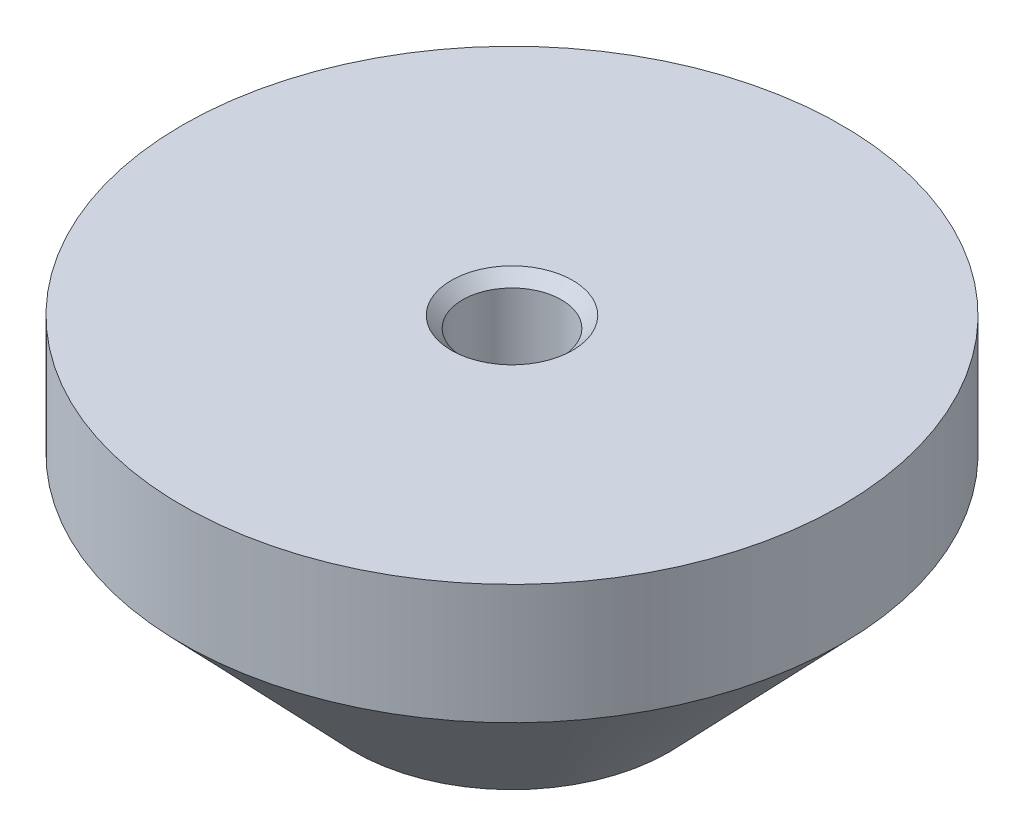
ISO-10303-21;
HEADER;
FILE_DESCRIPTION(('STEP AP214'),'2;1');
FILE_NAME('part.step','',(''),(''),'','','');
FILE_SCHEMA(('AUTOMOTIVE_DESIGN { 1 0 10303 214 1 1 1 1 }'));
ENDSEC;
DATA;
#1=APPLICATION_CONTEXT('core data for automotive mechanical design processes');
#2=APPLICATION_PROTOCOL_DEFINITION('international standard','automotive_design',2000,#1);
#3=PRODUCT_CONTEXT('',#1,'mechanical');
#4=PRODUCT('Part','Part','',(#3));
#5=PRODUCT_RELATED_PRODUCT_CATEGORY('part','',(#4));
#6=PRODUCT_DEFINITION_FORMATION('','',#4);
#7=PRODUCT_DEFINITION_CONTEXT('part definition',#1,'design');
#8=PRODUCT_DEFINITION('design','',#6,#7);
#9=PRODUCT_DEFINITION_SHAPE('','',#8);
#10=(LENGTH_UNIT() NAMED_UNIT(*) SI_UNIT(.MILLI.,.METRE.));
#11=(NAMED_UNIT(*) PLANE_ANGLE_UNIT() SI_UNIT($,.RADIAN.));
#12=(NAMED_UNIT(*) SI_UNIT($,.STERADIAN.) SOLID_ANGLE_UNIT());
#13=UNCERTAINTY_MEASURE_WITH_UNIT(LENGTH_MEASURE(1.E-05),#10,'distance_accuracy_value','');
#14=(GEOMETRIC_REPRESENTATION_CONTEXT(3) GLOBAL_UNCERTAINTY_ASSIGNED_CONTEXT((#13)) GLOBAL_UNIT_ASSIGNED_CONTEXT((#10,
#11,#12)) REPRESENTATION_CONTEXT('',''));
#15=CARTESIAN_POINT('',(0.,0.,0.));
#16=DIRECTION('',(0.,0.,1.));
#17=DIRECTION('',(1.,0.,0.));
#18=AXIS2_PLACEMENT_3D('',#15,#16,#17);
#19=CARTESIAN_POINT('',(0.,0.,0.));
#20=DIRECTION('',(0.,-1.,0.));
#21=DIRECTION('',(1.,0.,0.));
#22=AXIS2_PLACEMENT_3D('',#19,#20,#21);
#23=PLANE('',#22);
#24=CARTESIAN_POINT('',(0.,0.,0.));
#25=DIRECTION('',(0.,1.,0.));
#26=DIRECTION('',(0.,0.,1.));
#27=AXIS2_PLACEMENT_3D('',#24,#25,#26);
#28=CIRCLE('',#27,2.025);
#29=CARTESIAN_POINT('',(0.,0.,2.025));
#30=VERTEX_POINT('',#29);
#31=EDGE_CURVE('E65',#30,#30,#28,.T.);
#32=ORIENTED_EDGE('',*,*,#31,.F.);
#33=EDGE_LOOP('',(#32));
#34=FACE_BOUND('',#33,.T.);
#35=CARTESIAN_POINT('',(0.,0.,0.));
#36=DIRECTION('',(0.,-1.,0.));
#37=DIRECTION('',(1.,0.,0.));
#38=AXIS2_PLACEMENT_3D('',#35,#36,#37);
#39=CIRCLE('',#38,11.);
#40=CARTESIAN_POINT('',(11.,0.,0.));
#41=VERTEX_POINT('',#40);
#42=EDGE_CURVE('E11',#41,#41,#39,.T.);
#43=ORIENTED_EDGE('',*,*,#42,.F.);
#44=EDGE_LOOP('',(#43));
#45=FACE_BOUND('',#44,.T.);
#46=ADVANCED_FACE('F39',(#34,#45),#23,.F.);
#47=CARTESIAN_POINT('',(0.,-12.5,0.));
#48=DIRECTION('',(0.,-1.,0.));
#49=DIRECTION('',(1.,0.,0.));
#50=AXIS2_PLACEMENT_3D('',#47,#48,#49);
#51=CYLINDRICAL_SURFACE('',#50,11.);
#52=CARTESIAN_POINT('',(0.,-4.,0.));
#53=DIRECTION('',(0.,-1.,0.));
#54=DIRECTION('',(1.,0.,0.));
#55=AXIS2_PLACEMENT_3D('',#52,#53,#54);
#56=CIRCLE('',#55,11.);
#57=CARTESIAN_POINT('',(11.,-4.,0.));
#58=VERTEX_POINT('',#57);
#59=EDGE_CURVE('E45',#58,#58,#56,.T.);
#60=ORIENTED_EDGE('',*,*,#59,.F.);
#61=EDGE_LOOP('',(#60));
#62=FACE_BOUND('',#61,.T.);
#63=ORIENTED_EDGE('',*,*,#42,.T.);
#64=EDGE_LOOP('',(#63));
#65=FACE_BOUND('',#64,.T.);
#66=ADVANCED_FACE('F81',(#62,#65),#51,.T.);
#67=CARTESIAN_POINT('',(0.,-4.,0.));
#68=DIRECTION('',(0.,1.,0.));
#69=DIRECTION('',(-1.,0.,0.));
#70=AXIS2_PLACEMENT_3D('',#67,#68,#69);
#71=CONICAL_SURFACE('',#70,11.,0.764124777373387);
#72=CARTESIAN_POINT('',(0.,-10.,0.));
#73=DIRECTION('',(0.,-1.,0.));
#74=DIRECTION('',(1.,0.,0.));
#75=AXIS2_PLACEMENT_3D('',#72,#73,#74);
#76=CIRCLE('',#75,5.25);
#77=CARTESIAN_POINT('',(5.25,-10.,0.));
#78=VERTEX_POINT('',#77);
#79=EDGE_CURVE('E74',#78,#78,#76,.T.);
#80=ORIENTED_EDGE('',*,*,#79,.F.);
#81=EDGE_LOOP('',(#80));
#82=FACE_BOUND('',#81,.T.);
#83=ORIENTED_EDGE('',*,*,#59,.T.);
#84=EDGE_LOOP('',(#83));
#85=FACE_BOUND('',#84,.T.);
#86=ADVANCED_FACE('F79',(#82,#85),#71,.T.);
#87=CARTESIAN_POINT('',(-5.25,-10.,0.));
#88=DIRECTION('',(0.,1.,0.));
#89=DIRECTION('',(-1.,0.,0.));
#90=AXIS2_PLACEMENT_3D('',#87,#88,#89);
#91=PLANE('',#90);
#92=CARTESIAN_POINT('',(0.,-10.,0.));
#93=DIRECTION('',(0.,-1.,0.));
#94=DIRECTION('',(1.,0.,0.));
#95=AXIS2_PLACEMENT_3D('',#92,#93,#94);
#96=CIRCLE('',#95,4.5);
#97=CARTESIAN_POINT('',(4.5,-10.,0.));
#98=VERTEX_POINT('',#97);
#99=EDGE_CURVE('E71',#98,#98,#96,.T.);
#100=ORIENTED_EDGE('',*,*,#99,.F.);
#101=EDGE_LOOP('',(#100));
#102=FACE_BOUND('',#101,.T.);
#103=ORIENTED_EDGE('',*,*,#79,.T.);
#104=EDGE_LOOP('',(#103));
#105=FACE_BOUND('',#104,.T.);
#106=ADVANCED_FACE('F113',(#102,#105),#91,.F.);
#107=CARTESIAN_POINT('',(0.,-12.5,0.));
#108=DIRECTION('',(0.,-1.,0.));
#109=DIRECTION('',(1.,0.,0.));
#110=AXIS2_PLACEMENT_3D('',#107,#108,#109);
#111=CYLINDRICAL_SURFACE('',#110,4.5);
#112=CARTESIAN_POINT('',(0.,-8.3,0.));
#113=DIRECTION('',(0.,-1.,0.));
#114=DIRECTION('',(1.,0.,0.));
#115=AXIS2_PLACEMENT_3D('',#112,#113,#114);
#116=CIRCLE('',#115,4.5);
#117=CARTESIAN_POINT('',(4.5,-8.3,0.));
#118=VERTEX_POINT('',#117);
#119=EDGE_CURVE('E62',#118,#118,#116,.T.);
#120=ORIENTED_EDGE('',*,*,#119,.F.);
#121=EDGE_LOOP('',(#120));
#122=FACE_BOUND('',#121,.T.);
#123=ORIENTED_EDGE('',*,*,#99,.T.);
#124=EDGE_LOOP('',(#123));
#125=FACE_BOUND('',#124,.T.);
#126=ADVANCED_FACE('F109',(#122,#125),#111,.F.);
#127=CARTESIAN_POINT('',(-4.5,-8.3,0.));
#128=DIRECTION('',(0.,1.,0.));
#129=DIRECTION('',(-1.,0.,0.));
#130=AXIS2_PLACEMENT_3D('',#127,#128,#129);
#131=PLANE('',#130);
#132=CARTESIAN_POINT('',(0.,-8.3,0.));
#133=DIRECTION('',(0.,-1.,0.));
#134=DIRECTION('',(1.,0.,0.));
#135=AXIS2_PLACEMENT_3D('',#132,#133,#134);
#136=CIRCLE('',#135,4.2);
#137=CARTESIAN_POINT('',(4.2,-8.3,0.));
#138=VERTEX_POINT('',#137);
#139=EDGE_CURVE('E58',#138,#138,#136,.T.);
#140=ORIENTED_EDGE('',*,*,#139,.F.);
#141=EDGE_LOOP('',(#140));
#142=FACE_BOUND('',#141,.T.);
#143=ORIENTED_EDGE('',*,*,#119,.T.);
#144=EDGE_LOOP('',(#143));
#145=FACE_BOUND('',#144,.T.);
#146=ADVANCED_FACE('F105',(#142,#145),#131,.F.);
#147=CARTESIAN_POINT('',(0.,-8.3,0.));
#148=DIRECTION('',(0.,-1.,0.));
#149=DIRECTION('',(-1.,0.,0.));
#150=AXIS2_PLACEMENT_3D('',#147,#148,#149);
#151=SPHERICAL_SURFACE('',#150,4.2);
#152=ORIENTED_EDGE('',*,*,#139,.T.);
#153=EDGE_LOOP('',(#152));
#154=FACE_BOUND('',#153,.T.);
#155=ADVANCED_FACE('F52',(#154),#151,.T.);
#156=CARTESIAN_POINT('',(0.,-6.50857997860453,0.));
#157=DIRECTION('',(0.,1.,0.));
#158=DIRECTION('',(0.,0.,1.));
#159=AXIS2_PLACEMENT_3D('',#156,#157,#158);
#160=CONICAL_SURFACE('',#159,1.65,1.02974425867665);
#161=CARTESIAN_POINT('',(0.,-7.5,0.));
#162=VERTEX_POINT('',#161);
#163=VERTEX_LOOP('',#162);
#164=FACE_BOUND('',#163,.T.);
#165=CARTESIAN_POINT('',(0.,-6.50857997860453,0.));
#166=DIRECTION('',(0.,1.,0.));
#167=DIRECTION('',(0.,0.,1.));
#168=AXIS2_PLACEMENT_3D('',#165,#166,#167);
#169=CIRCLE('',#168,1.65);
#170=CARTESIAN_POINT('',(0.,-6.50857997860453,1.65));
#171=VERTEX_POINT('',#170);
#172=EDGE_CURVE('E56',#171,#171,#169,.T.);
#173=ORIENTED_EDGE('',*,*,#172,.T.);
#174=EDGE_LOOP('',(#173));
#175=FACE_BOUND('',#174,.T.);
#176=ADVANCED_FACE('F48',(#164,#175),#160,.F.);
#177=CARTESIAN_POINT('',(0.,0.,0.));
#178=DIRECTION('',(0.,1.,0.));
#179=DIRECTION('',(0.,0.,1.));
#180=AXIS2_PLACEMENT_3D('',#177,#178,#179);
#181=CYLINDRICAL_SURFACE('',#180,1.65);
#182=ORIENTED_EDGE('',*,*,#172,.F.);
#183=EDGE_LOOP('',(#182));
#184=FACE_BOUND('',#183,.T.);
#185=CARTESIAN_POINT('',(0.,-0.375000000000002,0.));
#186=DIRECTION('',(0.,1.,0.));
#187=DIRECTION('',(0.,0.,1.));
#188=AXIS2_PLACEMENT_3D('',#185,#186,#187);
#189=CIRCLE('',#188,1.65);
#190=CARTESIAN_POINT('',(0.,-0.375000000000002,1.65));
#191=VERTEX_POINT('',#190);
#192=EDGE_CURVE('E59',#191,#191,#189,.T.);
#193=ORIENTED_EDGE('',*,*,#192,.T.);
#194=EDGE_LOOP('',(#193));
#195=FACE_BOUND('',#194,.T.);
#196=ADVANCED_FACE('F51',(#184,#195),#181,.F.);
#197=CARTESIAN_POINT('',(0.,0.,0.));
#198=DIRECTION('',(0.,1.,0.));
#199=DIRECTION('',(0.,0.,1.));
#200=AXIS2_PLACEMENT_3D('',#197,#198,#199);
#201=CONICAL_SURFACE('',#200,2.025,0.785398163397447);
#202=ORIENTED_EDGE('',*,*,#192,.F.);
#203=EDGE_LOOP('',(#202));
#204=FACE_BOUND('',#203,.T.);
#205=ORIENTED_EDGE('',*,*,#31,.T.);
#206=EDGE_LOOP('',(#205));
#207=FACE_BOUND('',#206,.T.);
#208=ADVANCED_FACE('F93',(#204,#207),#201,.F.);
#209=CLOSED_SHELL('',(#46,#66,#86,#106,#126,#146,#155,#176,#196,#208));
#210=MANIFOLD_SOLID_BREP('B2',#209);
#211=ADVANCED_BREP_SHAPE_REPRESENTATION('',(#18,#210),#14);
#212=SHAPE_DEFINITION_REPRESENTATION(#9,#211);
ENDSEC;
END-ISO-10303-21;
